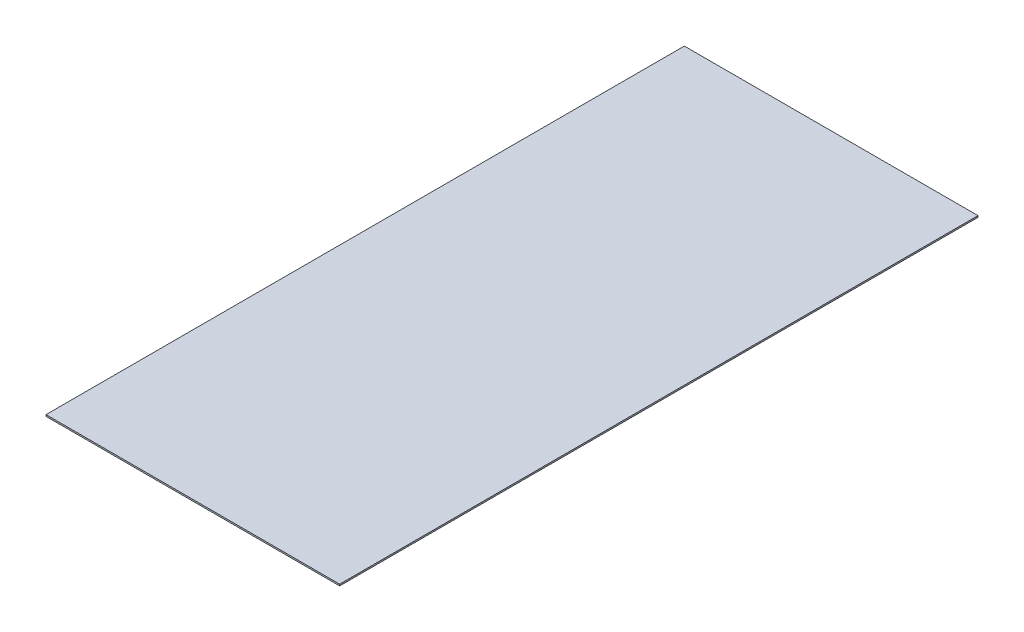
ISO-10303-21;
HEADER;
FILE_DESCRIPTION(('STEP AP214'),'2;1');
FILE_NAME('part.step','',(''),(''),'','','');
FILE_SCHEMA(('AUTOMOTIVE_DESIGN { 1 0 10303 214 1 1 1 1 }'));
ENDSEC;
DATA;
#1=APPLICATION_CONTEXT('core data for automotive mechanical design processes');
#2=APPLICATION_PROTOCOL_DEFINITION('international standard','automotive_design',2000,#1);
#3=PRODUCT_CONTEXT('',#1,'mechanical');
#4=PRODUCT('Part','Part','',(#3));
#5=PRODUCT_RELATED_PRODUCT_CATEGORY('part','',(#4));
#6=PRODUCT_DEFINITION_FORMATION('','',#4);
#7=PRODUCT_DEFINITION_CONTEXT('part definition',#1,'design');
#8=PRODUCT_DEFINITION('design','',#6,#7);
#9=PRODUCT_DEFINITION_SHAPE('','',#8);
#10=(LENGTH_UNIT() NAMED_UNIT(*) SI_UNIT(.MILLI.,.METRE.));
#11=(NAMED_UNIT(*) PLANE_ANGLE_UNIT() SI_UNIT($,.RADIAN.));
#12=(NAMED_UNIT(*) SI_UNIT($,.STERADIAN.) SOLID_ANGLE_UNIT());
#13=UNCERTAINTY_MEASURE_WITH_UNIT(LENGTH_MEASURE(1.E-05),#10,'distance_accuracy_value','');
#14=(GEOMETRIC_REPRESENTATION_CONTEXT(3) GLOBAL_UNCERTAINTY_ASSIGNED_CONTEXT((#13)) GLOBAL_UNIT_ASSIGNED_CONTEXT((#10,
#11,#12)) REPRESENTATION_CONTEXT('',''));
#15=CARTESIAN_POINT('',(0.,0.,0.));
#16=DIRECTION('',(0.,0.,1.));
#17=DIRECTION('',(1.,0.,0.));
#18=AXIS2_PLACEMENT_3D('',#15,#16,#17);
#19=CARTESIAN_POINT('',(-19.,0.,41.3));
#20=DIRECTION('',(0.,1.,0.));
#21=DIRECTION('',(0.,0.,1.));
#22=AXIS2_PLACEMENT_3D('',#19,#20,#21);
#23=PLANE('',#22);
#24=DIRECTION('',(0.,0.,-1.));
#25=VECTOR('',#24,1.);
#26=CARTESIAN_POINT('',(19.,0.,-41.3));
#27=LINE('',#26,#25);
#28=CARTESIAN_POINT('',(19.,0.,-41.3));
#29=VERTEX_POINT('',#28);
#30=CARTESIAN_POINT('',(19.,0.,41.3));
#31=VERTEX_POINT('',#30);
#32=EDGE_CURVE('E58',#29,#31,#27,.F.);
#33=ORIENTED_EDGE('',*,*,#32,.F.);
#34=DIRECTION('',(-1.,0.,0.));
#35=VECTOR('',#34,1.);
#36=CARTESIAN_POINT('',(-19.,0.,-41.3));
#37=LINE('',#36,#35);
#38=CARTESIAN_POINT('',(-19.,0.,-41.3));
#39=VERTEX_POINT('',#38);
#40=EDGE_CURVE('E53',#39,#29,#37,.F.);
#41=ORIENTED_EDGE('',*,*,#40,.F.);
#42=DIRECTION('',(0.,0.,1.));
#43=VECTOR('',#42,1.);
#44=CARTESIAN_POINT('',(-19.,0.,-41.3));
#45=LINE('',#44,#43);
#46=CARTESIAN_POINT('',(-19.,0.,41.3));
#47=VERTEX_POINT('',#46);
#48=EDGE_CURVE('E68',#47,#39,#45,.F.);
#49=ORIENTED_EDGE('',*,*,#48,.F.);
#50=DIRECTION('',(1.,0.,0.));
#51=VECTOR('',#50,1.);
#52=CARTESIAN_POINT('',(-19.,0.,41.3));
#53=LINE('',#52,#51);
#54=EDGE_CURVE('E20',#31,#47,#53,.F.);
#55=ORIENTED_EDGE('',*,*,#54,.F.);
#56=EDGE_LOOP('',(#33,#41,#49,#55));
#57=FACE_BOUND('',#56,.T.);
#58=ADVANCED_FACE('F17',(#57),#23,.T.);
#59=CARTESIAN_POINT('',(-19.,-0.2,41.3));
#60=DIRECTION('',(0.,0.,1.));
#61=DIRECTION('',(1.,0.,0.));
#62=AXIS2_PLACEMENT_3D('',#59,#60,#61);
#63=PLANE('',#62);
#64=DIRECTION('',(1.,0.,0.));
#65=VECTOR('',#64,1.);
#66=CARTESIAN_POINT('',(-19.,-0.2,41.3));
#67=LINE('',#66,#65);
#68=CARTESIAN_POINT('',(-19.,-0.2,41.3));
#69=VERTEX_POINT('',#68);
#70=CARTESIAN_POINT('',(19.,-0.2,41.3));
#71=VERTEX_POINT('',#70);
#72=EDGE_CURVE('E74',#69,#71,#67,.T.);
#73=ORIENTED_EDGE('',*,*,#72,.T.);
#74=DIRECTION('',(0.,1.,0.));
#75=VECTOR('',#74,1.);
#76=CARTESIAN_POINT('',(19.,-0.2,41.3));
#77=LINE('',#76,#75);
#78=EDGE_CURVE('E63',#31,#71,#77,.F.);
#79=ORIENTED_EDGE('',*,*,#78,.F.);
#80=ORIENTED_EDGE('',*,*,#54,.T.);
#81=DIRECTION('',(0.,1.,0.));
#82=VECTOR('',#81,1.);
#83=CARTESIAN_POINT('',(-19.,-0.2,41.3));
#84=LINE('',#83,#82);
#85=EDGE_CURVE('E81',#69,#47,#84,.T.);
#86=ORIENTED_EDGE('',*,*,#85,.F.);
#87=EDGE_LOOP('',(#73,#79,#80,#86));
#88=FACE_BOUND('',#87,.T.);
#89=ADVANCED_FACE('F73',(#88),#63,.T.);
#90=CARTESIAN_POINT('',(19.,-0.2,-41.3));
#91=DIRECTION('',(1.,0.,0.));
#92=DIRECTION('',(0.,0.,-1.));
#93=AXIS2_PLACEMENT_3D('',#90,#91,#92);
#94=PLANE('',#93);
#95=DIRECTION('',(0.,0.,1.));
#96=VECTOR('',#95,1.);
#97=CARTESIAN_POINT('',(19.,-0.2,41.3));
#98=LINE('',#97,#96);
#99=CARTESIAN_POINT('',(19.,-0.2,-41.3));
#100=VERTEX_POINT('',#99);
#101=EDGE_CURVE('E84',#71,#100,#98,.F.);
#102=ORIENTED_EDGE('',*,*,#101,.T.);
#103=DIRECTION('',(0.,1.,0.));
#104=VECTOR('',#103,1.);
#105=CARTESIAN_POINT('',(19.,-0.2,-41.3));
#106=LINE('',#105,#104);
#107=EDGE_CURVE('E65',#29,#100,#106,.F.);
#108=ORIENTED_EDGE('',*,*,#107,.F.);
#109=ORIENTED_EDGE('',*,*,#32,.T.);
#110=ORIENTED_EDGE('',*,*,#78,.T.);
#111=EDGE_LOOP('',(#102,#108,#109,#110));
#112=FACE_BOUND('',#111,.T.);
#113=ADVANCED_FACE('F61',(#112),#94,.T.);
#114=CARTESIAN_POINT('',(-19.,-0.2,-41.3));
#115=DIRECTION('',(0.,0.,-1.));
#116=DIRECTION('',(-1.,0.,0.));
#117=AXIS2_PLACEMENT_3D('',#114,#115,#116);
#118=PLANE('',#117);
#119=DIRECTION('',(1.,0.,0.));
#120=VECTOR('',#119,1.);
#121=CARTESIAN_POINT('',(-19.,-0.2,-41.3));
#122=LINE('',#121,#120);
#123=CARTESIAN_POINT('',(-19.,-0.2,-41.3));
#124=VERTEX_POINT('',#123);
#125=EDGE_CURVE('E26',#100,#124,#122,.F.);
#126=ORIENTED_EDGE('',*,*,#125,.T.);
#127=DIRECTION('',(0.,1.,0.));
#128=VECTOR('',#127,1.);
#129=CARTESIAN_POINT('',(-19.,-0.2,-41.3));
#130=LINE('',#129,#128);
#131=EDGE_CURVE('E34',#39,#124,#130,.F.);
#132=ORIENTED_EDGE('',*,*,#131,.F.);
#133=ORIENTED_EDGE('',*,*,#40,.T.);
#134=ORIENTED_EDGE('',*,*,#107,.T.);
#135=EDGE_LOOP('',(#126,#132,#133,#134));
#136=FACE_BOUND('',#135,.T.);
#137=ADVANCED_FACE('F88',(#136),#118,.T.);
#138=CARTESIAN_POINT('',(-19.,-0.2,-41.3));
#139=DIRECTION('',(-1.,0.,0.));
#140=DIRECTION('',(0.,0.,1.));
#141=AXIS2_PLACEMENT_3D('',#138,#139,#140);
#142=PLANE('',#141);
#143=DIRECTION('',(0.,0.,1.));
#144=VECTOR('',#143,1.);
#145=CARTESIAN_POINT('',(-19.,-0.2,41.3));
#146=LINE('',#145,#144);
#147=EDGE_CURVE('E11',#124,#69,#146,.T.);
#148=ORIENTED_EDGE('',*,*,#147,.T.);
#149=ORIENTED_EDGE('',*,*,#85,.T.);
#150=ORIENTED_EDGE('',*,*,#48,.T.);
#151=ORIENTED_EDGE('',*,*,#131,.T.);
#152=EDGE_LOOP('',(#148,#149,#150,#151));
#153=FACE_BOUND('',#152,.T.);
#154=ADVANCED_FACE('F91',(#153),#142,.T.);
#155=CARTESIAN_POINT('',(-19.,-0.2,41.3));
#156=DIRECTION('',(0.,1.,0.));
#157=DIRECTION('',(0.,0.,1.));
#158=AXIS2_PLACEMENT_3D('',#155,#156,#157);
#159=PLANE('',#158);
#160=ORIENTED_EDGE('',*,*,#125,.F.);
#161=ORIENTED_EDGE('',*,*,#101,.F.);
#162=ORIENTED_EDGE('',*,*,#72,.F.);
#163=ORIENTED_EDGE('',*,*,#147,.F.);
#164=EDGE_LOOP('',(#160,#161,#162,#163));
#165=FACE_BOUND('',#164,.T.);
#166=ADVANCED_FACE('F90',(#165),#159,.F.);
#167=CLOSED_SHELL('',(#58,#89,#113,#137,#154,#166));
#168=MANIFOLD_SOLID_BREP('B1',#167);
#169=ADVANCED_BREP_SHAPE_REPRESENTATION('',(#18,#168),#14);
#170=SHAPE_DEFINITION_REPRESENTATION(#9,#169);
ENDSEC;
END-ISO-10303-21;
